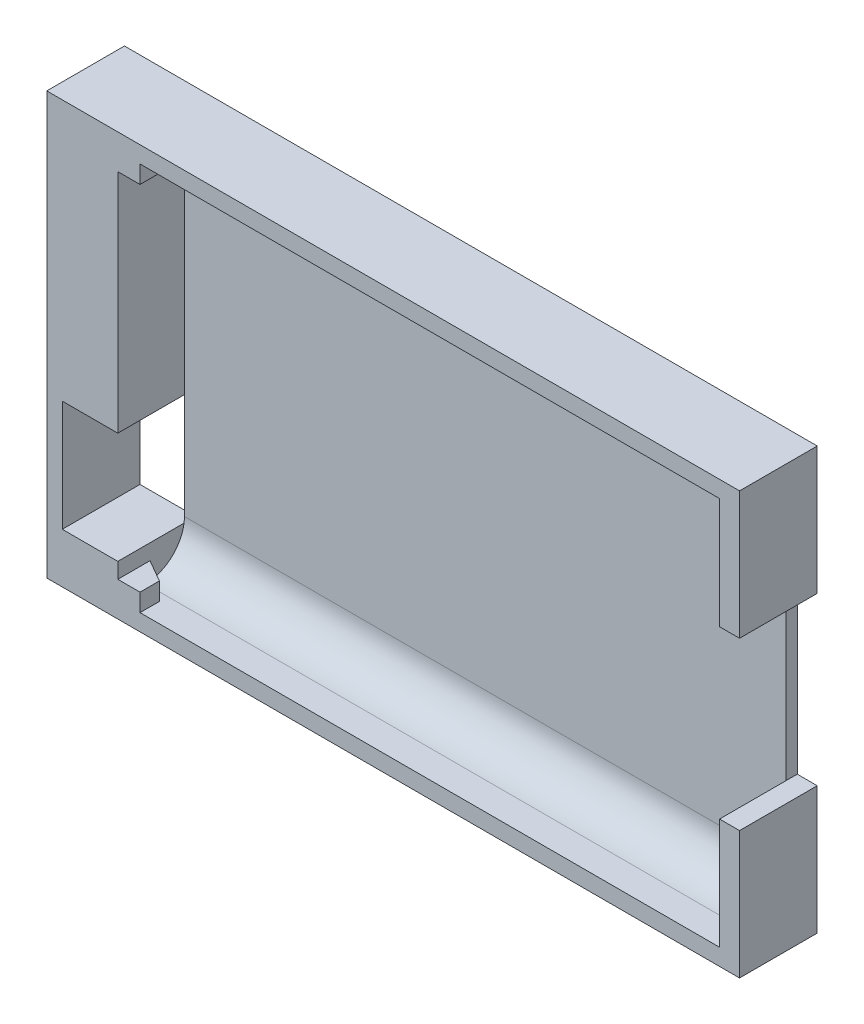
ISO-10303-21;
HEADER;
FILE_DESCRIPTION(('STEP AP214'),'2;1');
FILE_NAME('part.step','',(''),(''),'','','');
FILE_SCHEMA(('AUTOMOTIVE_DESIGN { 1 0 10303 214 1 1 1 1 }'));
ENDSEC;
DATA;
#1=APPLICATION_CONTEXT('core data for automotive mechanical design processes');
#2=APPLICATION_PROTOCOL_DEFINITION('international standard','automotive_design',2000,#1);
#3=PRODUCT_CONTEXT('',#1,'mechanical');
#4=PRODUCT('Part','Part','',(#3));
#5=PRODUCT_RELATED_PRODUCT_CATEGORY('part','',(#4));
#6=PRODUCT_DEFINITION_FORMATION('','',#4);
#7=PRODUCT_DEFINITION_CONTEXT('part definition',#1,'design');
#8=PRODUCT_DEFINITION('design','',#6,#7);
#9=PRODUCT_DEFINITION_SHAPE('','',#8);
#10=(LENGTH_UNIT() NAMED_UNIT(*) SI_UNIT(.MILLI.,.METRE.));
#11=(NAMED_UNIT(*) PLANE_ANGLE_UNIT() SI_UNIT($,.RADIAN.));
#12=(NAMED_UNIT(*) SI_UNIT($,.STERADIAN.) SOLID_ANGLE_UNIT());
#13=UNCERTAINTY_MEASURE_WITH_UNIT(LENGTH_MEASURE(1.E-05),#10,'distance_accuracy_value','');
#14=(GEOMETRIC_REPRESENTATION_CONTEXT(3) GLOBAL_UNCERTAINTY_ASSIGNED_CONTEXT((#13)) GLOBAL_UNIT_ASSIGNED_CONTEXT((#10,
#11,#12)) REPRESENTATION_CONTEXT('',''));
#15=CARTESIAN_POINT('',(0.,0.,0.));
#16=DIRECTION('',(0.,0.,1.));
#17=DIRECTION('',(1.,0.,0.));
#18=AXIS2_PLACEMENT_3D('',#15,#16,#17);
#19=CARTESIAN_POINT('',(-27.1,14.,4.5));
#20=DIRECTION('',(-1.,0.,0.));
#21=DIRECTION('',(0.,0.,1.));
#22=AXIS2_PLACEMENT_3D('',#19,#20,#21);
#23=PLANE('',#22);
#24=DIRECTION('',(0.,-1.,0.));
#25=VECTOR('',#24,1.);
#26=CARTESIAN_POINT('',(-27.1,0.,7.));
#27=LINE('',#26,#25);
#28=CARTESIAN_POINT('',(-27.1,15.9,7.));
#29=VERTEX_POINT('',#28);
#30=CARTESIAN_POINT('',(-27.1,-4.5,7.));
#31=VERTEX_POINT('',#30);
#32=EDGE_CURVE('E374',#29,#31,#27,.T.);
#33=ORIENTED_EDGE('',*,*,#32,.T.);
#34=DIRECTION('',(0.,0.,1.));
#35=VECTOR('',#34,1.);
#36=CARTESIAN_POINT('',(-27.1,-4.5,0.));
#37=LINE('',#36,#35);
#38=CARTESIAN_POINT('',(-27.1,-4.5,1.));
#39=VERTEX_POINT('',#38);
#40=EDGE_CURVE('E240',#39,#31,#37,.T.);
#41=ORIENTED_EDGE('',*,*,#40,.F.);
#42=DIRECTION('',(0.,1.,0.));
#43=VECTOR('',#42,1.);
#44=CARTESIAN_POINT('',(-27.1,-14.,1.));
#45=LINE('',#44,#43);
#46=CARTESIAN_POINT('',(-27.1,14.,1.));
#47=VERTEX_POINT('',#46);
#48=EDGE_CURVE('E298',#39,#47,#45,.T.);
#49=ORIENTED_EDGE('',*,*,#48,.T.);
#50=CARTESIAN_POINT('',(-27.1,14.,4.5));
#51=DIRECTION('',(1.,0.,0.));
#52=DIRECTION('',(0.,0.,1.));
#53=AXIS2_PLACEMENT_3D('',#50,#51,#52);
#54=CIRCLE('',#53,3.5);
#55=CARTESIAN_POINT('',(-27.1,17.4770677301427,4.1));
#56=VERTEX_POINT('',#55);
#57=EDGE_CURVE('E302',#47,#56,#54,.T.);
#58=ORIENTED_EDGE('',*,*,#57,.T.);
#59=DIRECTION('',(0.,1.,0.));
#60=VECTOR('',#59,1.);
#61=CARTESIAN_POINT('',(-27.1,15.9,4.1));
#62=LINE('',#61,#60);
#63=CARTESIAN_POINT('',(-27.1,15.9,4.1));
#64=VERTEX_POINT('',#63);
#65=EDGE_CURVE('E268',#64,#56,#62,.T.);
#66=ORIENTED_EDGE('',*,*,#65,.F.);
#67=DIRECTION('',(0.,0.,-1.));
#68=VECTOR('',#67,1.);
#69=CARTESIAN_POINT('',(-27.1,15.9,4.1));
#70=LINE('',#69,#68);
#71=EDGE_CURVE('E256',#29,#64,#70,.T.);
#72=ORIENTED_EDGE('',*,*,#71,.F.);
#73=EDGE_LOOP('',(#33,#41,#49,#58,#66,#72));
#74=FACE_BOUND('',#73,.T.);
#75=ADVANCED_FACE('F33',(#74),#23,.F.);
#76=CARTESIAN_POINT('',(-27.1,17.5,8.));
#77=DIRECTION('',(0.,1.,0.));
#78=DIRECTION('',(0.,0.,1.));
#79=AXIS2_PLACEMENT_3D('',#76,#77,#78);
#80=PLANE('',#79);
#81=DIRECTION('',(0.,0.,1.));
#82=VECTOR('',#81,1.);
#83=CARTESIAN_POINT('',(-25.1,17.5,7.));
#84=LINE('',#83,#82);
#85=CARTESIAN_POINT('',(-25.1,17.5,5.25470053837925));
#86=VERTEX_POINT('',#85);
#87=CARTESIAN_POINT('',(-25.1,17.5,7.));
#88=VERTEX_POINT('',#87);
#89=EDGE_CURVE('E255',#86,#88,#84,.T.);
#90=ORIENTED_EDGE('',*,*,#89,.F.);
#91=DIRECTION('',(0.86602540378444,0.,0.499999999999997));
#92=VECTOR('',#91,1.);
#93=CARTESIAN_POINT('',(-25.4112504626204,17.5,5.07499999999999));
#94=LINE('',#93,#92);
#95=CARTESIAN_POINT('',(-26.4071796769725,17.5,4.5));
#96=VERTEX_POINT('',#95);
#97=EDGE_CURVE('E386',#86,#96,#94,.F.);
#98=ORIENTED_EDGE('',*,*,#97,.T.);
#99=DIRECTION('',(1.,0.,0.));
#100=VECTOR('',#99,1.);
#101=CARTESIAN_POINT('',(-27.1,17.5,4.5));
#102=LINE('',#101,#100);
#103=CARTESIAN_POINT('',(27.1,17.5,4.5));
#104=VERTEX_POINT('',#103);
#105=EDGE_CURVE('E322',#96,#104,#102,.T.);
#106=ORIENTED_EDGE('',*,*,#105,.T.);
#107=DIRECTION('',(0.,0.,1.));
#108=VECTOR('',#107,1.);
#109=CARTESIAN_POINT('',(27.1,17.5,8.));
#110=LINE('',#109,#108);
#111=CARTESIAN_POINT('',(27.1,17.5,7.));
#112=VERTEX_POINT('',#111);
#113=EDGE_CURVE('E319',#104,#112,#110,.T.);
#114=ORIENTED_EDGE('',*,*,#113,.T.);
#115=DIRECTION('',(-1.,0.,0.));
#116=VECTOR('',#115,1.);
#117=CARTESIAN_POINT('',(0.,17.5,7.));
#118=LINE('',#117,#116);
#119=EDGE_CURVE('E370',#112,#88,#118,.T.);
#120=ORIENTED_EDGE('',*,*,#119,.T.);
#121=EDGE_LOOP('',(#90,#98,#106,#114,#120));
#122=FACE_BOUND('',#121,.T.);
#123=ADVANCED_FACE('F452',(#122),#80,.F.);
#124=CARTESIAN_POINT('',(-27.1,14.,4.5));
#125=DIRECTION('',(1.,0.,0.));
#126=DIRECTION('',(0.,0.,-1.));
#127=AXIS2_PLACEMENT_3D('',#124,#125,#126);
#128=CYLINDRICAL_SURFACE('',#127,3.5);
#129=ORIENTED_EDGE('',*,*,#105,.F.);
#130=CARTESIAN_POINT('',(-26.4071796769725,14.,4.5));
#131=DIRECTION('',(-0.499999999999997,0.,0.86602540378444));
#132=DIRECTION('',(0.86602540378444,0.,0.499999999999997));
#133=AXIS2_PLACEMENT_3D('',#130,#131,#132);
#134=ELLIPSE('',#133,7.00000000000004,3.5);
#135=EDGE_CURVE('E389',#96,#56,#134,.T.);
#136=ORIENTED_EDGE('',*,*,#135,.T.);
#137=ORIENTED_EDGE('',*,*,#57,.F.);
#138=DIRECTION('',(1.,0.,0.));
#139=VECTOR('',#138,1.);
#140=CARTESIAN_POINT('',(-27.1,14.,1.));
#141=LINE('',#140,#139);
#142=CARTESIAN_POINT('',(27.1,14.,1.));
#143=VERTEX_POINT('',#142);
#144=EDGE_CURVE('E325',#47,#143,#141,.T.);
#145=ORIENTED_EDGE('',*,*,#144,.T.);
#146=CARTESIAN_POINT('',(27.1,14.,4.5));
#147=DIRECTION('',(1.,0.,0.));
#148=DIRECTION('',(0.,0.,1.));
#149=AXIS2_PLACEMENT_3D('',#146,#147,#148);
#150=CIRCLE('',#149,3.5);
#151=EDGE_CURVE('E315',#143,#104,#150,.T.);
#152=ORIENTED_EDGE('',*,*,#151,.T.);
#153=EDGE_LOOP('',(#129,#136,#137,#145,#152));
#154=FACE_BOUND('',#153,.T.);
#155=ADVANCED_FACE('F494',(#154),#128,.F.);
#156=CARTESIAN_POINT('',(-27.1,-14.,4.5));
#157=DIRECTION('',(1.,0.,0.));
#158=DIRECTION('',(0.,0.,-1.));
#159=AXIS2_PLACEMENT_3D('',#156,#157,#158);
#160=CIRCLE('',#159,3.5);
#161=CARTESIAN_POINT('',(-27.1,-17.4770677301427,4.1));
#162=VERTEX_POINT('',#161);
#163=CARTESIAN_POINT('',(-27.1,-14.5,1.03589838486224));
#164=VERTEX_POINT('',#163);
#165=EDGE_CURVE('E295',#162,#164,#160,.T.);
#166=ORIENTED_EDGE('',*,*,#165,.T.);
#167=DIRECTION('',(0.,0.,1.));
#168=VECTOR('',#167,1.);
#169=CARTESIAN_POINT('',(-27.1,-14.5,0.));
#170=LINE('',#169,#168);
#171=CARTESIAN_POINT('',(-27.1,-14.5,7.));
#172=VERTEX_POINT('',#171);
#173=EDGE_CURVE('E213',#164,#172,#170,.T.);
#174=ORIENTED_EDGE('',*,*,#173,.T.);
#175=CARTESIAN_POINT('',(-27.1,-15.9,7.));
#176=VERTEX_POINT('',#175);
#177=EDGE_CURVE('E373',#172,#176,#27,.T.);
#178=ORIENTED_EDGE('',*,*,#177,.T.);
#179=DIRECTION('',(0.,0.,-1.));
#180=VECTOR('',#179,1.);
#181=CARTESIAN_POINT('',(-27.1,-15.9,4.1));
#182=LINE('',#181,#180);
#183=CARTESIAN_POINT('',(-27.1,-15.9,4.1));
#184=VERTEX_POINT('',#183);
#185=EDGE_CURVE('E236',#176,#184,#182,.T.);
#186=ORIENTED_EDGE('',*,*,#185,.T.);
#187=DIRECTION('',(0.,-1.,0.));
#188=VECTOR('',#187,1.);
#189=CARTESIAN_POINT('',(-27.1,-15.9,4.1));
#190=LINE('',#189,#188);
#191=EDGE_CURVE('E249',#184,#162,#190,.T.);
#192=ORIENTED_EDGE('',*,*,#191,.T.);
#193=EDGE_LOOP('',(#166,#174,#178,#186,#192));
#194=FACE_BOUND('',#193,.T.);
#195=ADVANCED_FACE('F509',(#194),#23,.F.);
#196=CARTESIAN_POINT('',(28.9,19.,7.));
#197=DIRECTION('',(-1.,0.,0.));
#198=DIRECTION('',(0.,-1.,0.));
#199=AXIS2_PLACEMENT_3D('',#196,#197,#198);
#200=PLANE('',#199);
#201=DIRECTION('',(0.,1.,0.));
#202=VECTOR('',#201,1.);
#203=CARTESIAN_POINT('',(28.9,19.,7.));
#204=LINE('',#203,#202);
#205=CARTESIAN_POINT('',(28.9,7.5,7.));
#206=VERTEX_POINT('',#205);
#207=CARTESIAN_POINT('',(28.9,19.,7.));
#208=VERTEX_POINT('',#207);
#209=EDGE_CURVE('E337',#206,#208,#204,.T.);
#210=ORIENTED_EDGE('',*,*,#209,.F.);
#211=DIRECTION('',(0.,0.,1.));
#212=VECTOR('',#211,1.);
#213=CARTESIAN_POINT('',(28.9,7.5,0.));
#214=LINE('',#213,#212);
#215=CARTESIAN_POINT('',(28.9,7.5,0.));
#216=VERTEX_POINT('',#215);
#217=EDGE_CURVE('E289',#216,#206,#214,.T.);
#218=ORIENTED_EDGE('',*,*,#217,.F.);
#219=DIRECTION('',(0.,1.,0.));
#220=VECTOR('',#219,1.);
#221=CARTESIAN_POINT('',(28.9,19.,0.));
#222=LINE('',#221,#220);
#223=CARTESIAN_POINT('',(28.9,19.,0.));
#224=VERTEX_POINT('',#223);
#225=EDGE_CURVE('E348',#216,#224,#222,.T.);
#226=ORIENTED_EDGE('',*,*,#225,.T.);
#227=DIRECTION('',(0.,0.,-1.));
#228=VECTOR('',#227,1.);
#229=CARTESIAN_POINT('',(28.9,19.,7.));
#230=LINE('',#229,#228);
#231=EDGE_CURVE('E355',#208,#224,#230,.T.);
#232=ORIENTED_EDGE('',*,*,#231,.F.);
#233=EDGE_LOOP('',(#210,#218,#226,#232));
#234=FACE_BOUND('',#233,.T.);
#235=ADVANCED_FACE('F472',(#234),#200,.F.);
#236=CARTESIAN_POINT('',(27.1,14.,4.5));
#237=DIRECTION('',(-1.,0.,0.));
#238=DIRECTION('',(0.,0.,1.));
#239=AXIS2_PLACEMENT_3D('',#236,#237,#238);
#240=PLANE('',#239);
#241=DIRECTION('',(0.,0.,-1.));
#242=VECTOR('',#241,1.);
#243=CARTESIAN_POINT('',(27.1,7.5,4.5));
#244=LINE('',#243,#242);
#245=CARTESIAN_POINT('',(27.1,7.5,7.));
#246=VERTEX_POINT('',#245);
#247=CARTESIAN_POINT('',(27.1,7.5,0.999999999999999));
#248=VERTEX_POINT('',#247);
#249=EDGE_CURVE('E379',#246,#248,#244,.T.);
#250=ORIENTED_EDGE('',*,*,#249,.F.);
#251=DIRECTION('',(0.,-1.,0.));
#252=VECTOR('',#251,1.);
#253=CARTESIAN_POINT('',(27.1,0.,7.));
#254=LINE('',#253,#252);
#255=EDGE_CURVE('E365',#112,#246,#254,.T.);
#256=ORIENTED_EDGE('',*,*,#255,.F.);
#257=ORIENTED_EDGE('',*,*,#113,.F.);
#258=ORIENTED_EDGE('',*,*,#151,.F.);
#259=DIRECTION('',(0.,1.,0.));
#260=VECTOR('',#259,1.);
#261=CARTESIAN_POINT('',(27.1,-14.,1.));
#262=LINE('',#261,#260);
#263=EDGE_CURVE('E311',#248,#143,#262,.T.);
#264=ORIENTED_EDGE('',*,*,#263,.F.);
#265=EDGE_LOOP('',(#250,#256,#257,#258,#264));
#266=FACE_BOUND('',#265,.T.);
#267=ADVANCED_FACE('F457',(#266),#240,.T.);
#268=CARTESIAN_POINT('',(-33.5,19.,7.));
#269=DIRECTION('',(1.,0.,0.));
#270=DIRECTION('',(0.,1.,0.));
#271=AXIS2_PLACEMENT_3D('',#268,#269,#270);
#272=PLANE('',#271);
#273=DIRECTION('',(0.,-1.,0.));
#274=VECTOR('',#273,1.);
#275=CARTESIAN_POINT('',(-33.5,19.,0.));
#276=LINE('',#275,#274);
#277=CARTESIAN_POINT('',(-33.5,19.,0.));
#278=VERTEX_POINT('',#277);
#279=CARTESIAN_POINT('',(-33.5,-19.,0.));
#280=VERTEX_POINT('',#279);
#281=EDGE_CURVE('E324',#278,#280,#276,.T.);
#282=ORIENTED_EDGE('',*,*,#281,.T.);
#283=DIRECTION('',(0.,0.,-1.));
#284=VECTOR('',#283,1.);
#285=CARTESIAN_POINT('',(-33.5,-19.,7.));
#286=LINE('',#285,#284);
#287=CARTESIAN_POINT('',(-33.5,-19.,7.));
#288=VERTEX_POINT('',#287);
#289=EDGE_CURVE('E361',#288,#280,#286,.T.);
#290=ORIENTED_EDGE('',*,*,#289,.F.);
#291=DIRECTION('',(0.,-1.,0.));
#292=VECTOR('',#291,1.);
#293=CARTESIAN_POINT('',(-33.5,19.,7.));
#294=LINE('',#293,#292);
#295=CARTESIAN_POINT('',(-33.5,19.,7.));
#296=VERTEX_POINT('',#295);
#297=EDGE_CURVE('E331',#296,#288,#294,.T.);
#298=ORIENTED_EDGE('',*,*,#297,.F.);
#299=DIRECTION('',(0.,0.,-1.));
#300=VECTOR('',#299,1.);
#301=CARTESIAN_POINT('',(-33.5,19.,7.));
#302=LINE('',#301,#300);
#303=EDGE_CURVE('E343',#296,#278,#302,.T.);
#304=ORIENTED_EDGE('',*,*,#303,.T.);
#305=EDGE_LOOP('',(#282,#290,#298,#304));
#306=FACE_BOUND('',#305,.T.);
#307=ADVANCED_FACE('F482',(#306),#272,.F.);
#308=CARTESIAN_POINT('',(-33.5,-19.,7.));
#309=DIRECTION('',(0.,1.,0.));
#310=DIRECTION('',(0.,0.,1.));
#311=AXIS2_PLACEMENT_3D('',#308,#309,#310);
#312=PLANE('',#311);
#313=DIRECTION('',(1.,0.,0.));
#314=VECTOR('',#313,1.);
#315=CARTESIAN_POINT('',(-33.5,-19.,0.));
#316=LINE('',#315,#314);
#317=CARTESIAN_POINT('',(28.9,-19.,0.));
#318=VERTEX_POINT('',#317);
#319=EDGE_CURVE('E346',#280,#318,#316,.T.);
#320=ORIENTED_EDGE('',*,*,#319,.T.);
#321=DIRECTION('',(0.,0.,-1.));
#322=VECTOR('',#321,1.);
#323=CARTESIAN_POINT('',(28.9,-19.,7.));
#324=LINE('',#323,#322);
#325=CARTESIAN_POINT('',(28.9,-19.,7.));
#326=VERTEX_POINT('',#325);
#327=EDGE_CURVE('E358',#326,#318,#324,.T.);
#328=ORIENTED_EDGE('',*,*,#327,.F.);
#329=DIRECTION('',(1.,0.,0.));
#330=VECTOR('',#329,1.);
#331=CARTESIAN_POINT('',(-33.5,-19.,7.));
#332=LINE('',#331,#330);
#333=EDGE_CURVE('E334',#288,#326,#332,.T.);
#334=ORIENTED_EDGE('',*,*,#333,.F.);
#335=ORIENTED_EDGE('',*,*,#289,.T.);
#336=EDGE_LOOP('',(#320,#328,#334,#335));
#337=FACE_BOUND('',#336,.T.);
#338=ADVANCED_FACE('F484',(#337),#312,.F.);
#339=CARTESIAN_POINT('',(28.9,-7.5,0.));
#340=VERTEX_POINT('',#339);
#341=EDGE_CURVE('E349',#318,#340,#222,.T.);
#342=ORIENTED_EDGE('',*,*,#341,.T.);
#343=DIRECTION('',(0.,0.,1.));
#344=VECTOR('',#343,1.);
#345=CARTESIAN_POINT('',(28.9,-7.5,0.));
#346=LINE('',#345,#344);
#347=CARTESIAN_POINT('',(28.9,-7.5,7.));
#348=VERTEX_POINT('',#347);
#349=EDGE_CURVE('E291',#340,#348,#346,.T.);
#350=ORIENTED_EDGE('',*,*,#349,.T.);
#351=EDGE_CURVE('E338',#326,#348,#204,.T.);
#352=ORIENTED_EDGE('',*,*,#351,.F.);
#353=ORIENTED_EDGE('',*,*,#327,.T.);
#354=EDGE_LOOP('',(#342,#350,#352,#353));
#355=FACE_BOUND('',#354,.T.);
#356=ADVANCED_FACE('F488',(#355),#200,.F.);
#357=CARTESIAN_POINT('',(-33.5,19.,7.));
#358=DIRECTION('',(0.,-1.,0.));
#359=DIRECTION('',(0.,0.,-1.));
#360=AXIS2_PLACEMENT_3D('',#357,#358,#359);
#361=PLANE('',#360);
#362=DIRECTION('',(-1.,0.,0.));
#363=VECTOR('',#362,1.);
#364=CARTESIAN_POINT('',(-33.5,19.,0.));
#365=LINE('',#364,#363);
#366=EDGE_CURVE('E335',#224,#278,#365,.T.);
#367=ORIENTED_EDGE('',*,*,#366,.T.);
#368=ORIENTED_EDGE('',*,*,#303,.F.);
#369=DIRECTION('',(-1.,0.,0.));
#370=VECTOR('',#369,1.);
#371=CARTESIAN_POINT('',(-33.5,19.,7.));
#372=LINE('',#371,#370);
#373=EDGE_CURVE('E341',#208,#296,#372,.T.);
#374=ORIENTED_EDGE('',*,*,#373,.F.);
#375=ORIENTED_EDGE('',*,*,#231,.T.);
#376=EDGE_LOOP('',(#367,#368,#374,#375));
#377=FACE_BOUND('',#376,.T.);
#378=ADVANCED_FACE('F479',(#377),#361,.F.);
#379=CARTESIAN_POINT('',(0.,0.,7.));
#380=DIRECTION('',(0.,0.,1.));
#381=DIRECTION('',(1.,0.,0.));
#382=AXIS2_PLACEMENT_3D('',#379,#380,#381);
#383=PLANE('',#382);
#384=DIRECTION('',(-1.,0.,0.));
#385=VECTOR('',#384,1.);
#386=CARTESIAN_POINT('',(-32.1,-4.49999999999999,7.));
#387=LINE('',#386,#385);
#388=CARTESIAN_POINT('',(-32.1,-4.49999999999999,7.));
#389=VERTEX_POINT('',#388);
#390=EDGE_CURVE('E224',#31,#389,#387,.T.);
#391=ORIENTED_EDGE('',*,*,#390,.F.);
#392=ORIENTED_EDGE('',*,*,#32,.F.);
#393=DIRECTION('',(-1.,0.,0.));
#394=VECTOR('',#393,1.);
#395=CARTESIAN_POINT('',(-27.1,15.9,7.));
#396=LINE('',#395,#394);
#397=CARTESIAN_POINT('',(-25.1,15.9,7.));
#398=VERTEX_POINT('',#397);
#399=EDGE_CURVE('E261',#398,#29,#396,.T.);
#400=ORIENTED_EDGE('',*,*,#399,.F.);
#401=DIRECTION('',(0.,1.,0.));
#402=VECTOR('',#401,1.);
#403=CARTESIAN_POINT('',(-25.1,15.9,7.));
#404=LINE('',#403,#402);
#405=EDGE_CURVE('E264',#398,#88,#404,.T.);
#406=ORIENTED_EDGE('',*,*,#405,.T.);
#407=ORIENTED_EDGE('',*,*,#119,.F.);
#408=ORIENTED_EDGE('',*,*,#255,.T.);
#409=DIRECTION('',(-1.,0.,0.));
#410=VECTOR('',#409,1.);
#411=CARTESIAN_POINT('',(28.9,7.5,7.));
#412=LINE('',#411,#410);
#413=EDGE_CURVE('E276',#206,#246,#412,.T.);
#414=ORIENTED_EDGE('',*,*,#413,.F.);
#415=ORIENTED_EDGE('',*,*,#209,.T.);
#416=ORIENTED_EDGE('',*,*,#373,.T.);
#417=ORIENTED_EDGE('',*,*,#297,.T.);
#418=ORIENTED_EDGE('',*,*,#333,.T.);
#419=ORIENTED_EDGE('',*,*,#351,.T.);
#420=DIRECTION('',(1.,0.,0.));
#421=VECTOR('',#420,1.);
#422=CARTESIAN_POINT('',(28.9,-7.5,7.));
#423=LINE('',#422,#421);
#424=CARTESIAN_POINT('',(27.1,-7.5,7.));
#425=VERTEX_POINT('',#424);
#426=EDGE_CURVE('E271',#425,#348,#423,.T.);
#427=ORIENTED_EDGE('',*,*,#426,.F.);
#428=CARTESIAN_POINT('',(27.1,-17.5,7.));
#429=VERTEX_POINT('',#428);
#430=EDGE_CURVE('E364',#425,#429,#254,.T.);
#431=ORIENTED_EDGE('',*,*,#430,.T.);
#432=DIRECTION('',(1.,0.,0.));
#433=VECTOR('',#432,1.);
#434=CARTESIAN_POINT('',(0.,-17.5,7.));
#435=LINE('',#434,#433);
#436=CARTESIAN_POINT('',(-25.1,-17.5,7.));
#437=VERTEX_POINT('',#436);
#438=EDGE_CURVE('E368',#437,#429,#435,.T.);
#439=ORIENTED_EDGE('',*,*,#438,.F.);
#440=DIRECTION('',(0.,-1.,0.));
#441=VECTOR('',#440,1.);
#442=CARTESIAN_POINT('',(-25.1,-15.9,7.));
#443=LINE('',#442,#441);
#444=CARTESIAN_POINT('',(-25.1,-15.9,7.));
#445=VERTEX_POINT('',#444);
#446=EDGE_CURVE('E252',#445,#437,#443,.T.);
#447=ORIENTED_EDGE('',*,*,#446,.F.);
#448=DIRECTION('',(-1.,0.,0.));
#449=VECTOR('',#448,1.);
#450=CARTESIAN_POINT('',(-27.1,-15.9,7.));
#451=LINE('',#450,#449);
#452=EDGE_CURVE('E244',#445,#176,#451,.T.);
#453=ORIENTED_EDGE('',*,*,#452,.T.);
#454=ORIENTED_EDGE('',*,*,#177,.F.);
#455=DIRECTION('',(1.,0.,0.));
#456=VECTOR('',#455,1.);
#457=CARTESIAN_POINT('',(-32.1,-14.5,7.));
#458=LINE('',#457,#456);
#459=CARTESIAN_POINT('',(-32.1,-14.5,7.));
#460=VERTEX_POINT('',#459);
#461=EDGE_CURVE('E227',#460,#172,#458,.T.);
#462=ORIENTED_EDGE('',*,*,#461,.F.);
#463=DIRECTION('',(0.,-1.,0.));
#464=VECTOR('',#463,1.);
#465=CARTESIAN_POINT('',(-32.1,-4.49999999999999,7.));
#466=LINE('',#465,#464);
#467=EDGE_CURVE('E210',#389,#460,#466,.T.);
#468=ORIENTED_EDGE('',*,*,#467,.F.);
#469=EDGE_LOOP('',(#391,#392,#400,#406,#407,#408,#414,#415,#416,#417,#418,#419,#427,#431,#439,
#447,#453,#454,#462,#468));
#470=FACE_BOUND('',#469,.T.);
#471=ADVANCED_FACE('F418',(#470),#383,.T.);
#472=CARTESIAN_POINT('',(0.,0.,0.));
#473=DIRECTION('',(0.,0.,1.));
#474=DIRECTION('',(1.,0.,0.));
#475=AXIS2_PLACEMENT_3D('',#472,#473,#474);
#476=PLANE('',#475);
#477=DIRECTION('',(-1.,0.,0.));
#478=VECTOR('',#477,1.);
#479=CARTESIAN_POINT('',(-32.1,-4.49999999999999,0.));
#480=LINE('',#479,#478);
#481=CARTESIAN_POINT('',(-27.1,-4.5,0.));
#482=VERTEX_POINT('',#481);
#483=CARTESIAN_POINT('',(-32.1,-4.49999999999999,0.));
#484=VERTEX_POINT('',#483);
#485=EDGE_CURVE('E214',#482,#484,#480,.T.);
#486=ORIENTED_EDGE('',*,*,#485,.T.);
#487=DIRECTION('',(0.,-1.,0.));
#488=VECTOR('',#487,1.);
#489=CARTESIAN_POINT('',(-32.1,-4.49999999999999,0.));
#490=LINE('',#489,#488);
#491=CARTESIAN_POINT('',(-32.1,-14.5,0.));
#492=VERTEX_POINT('',#491);
#493=EDGE_CURVE('E207',#484,#492,#490,.T.);
#494=ORIENTED_EDGE('',*,*,#493,.T.);
#495=DIRECTION('',(1.,0.,0.));
#496=VECTOR('',#495,1.);
#497=CARTESIAN_POINT('',(-32.1,-14.5,0.));
#498=LINE('',#497,#496);
#499=CARTESIAN_POINT('',(-27.1,-14.5,0.));
#500=VERTEX_POINT('',#499);
#501=EDGE_CURVE('E217',#492,#500,#498,.T.);
#502=ORIENTED_EDGE('',*,*,#501,.T.);
#503=DIRECTION('',(0.,1.,0.));
#504=VECTOR('',#503,1.);
#505=CARTESIAN_POINT('',(-27.1,-4.5,0.));
#506=LINE('',#505,#504);
#507=EDGE_CURVE('E48',#500,#482,#506,.T.);
#508=ORIENTED_EDGE('',*,*,#507,.T.);
#509=EDGE_LOOP('',(#486,#494,#502,#508));
#510=FACE_BOUND('',#509,.T.);
#511=ORIENTED_EDGE('',*,*,#225,.F.);
#512=DIRECTION('',(-1.,0.,0.));
#513=VECTOR('',#512,1.);
#514=CARTESIAN_POINT('',(28.9,7.5,0.));
#515=LINE('',#514,#513);
#516=CARTESIAN_POINT('',(27.1,7.5,0.));
#517=VERTEX_POINT('',#516);
#518=EDGE_CURVE('E279',#216,#517,#515,.T.);
#519=ORIENTED_EDGE('',*,*,#518,.T.);
#520=DIRECTION('',(0.,-1.,0.));
#521=VECTOR('',#520,1.);
#522=CARTESIAN_POINT('',(27.1,7.5,0.));
#523=LINE('',#522,#521);
#524=CARTESIAN_POINT('',(27.1,-7.5,0.));
#525=VERTEX_POINT('',#524);
#526=EDGE_CURVE('E272',#517,#525,#523,.T.);
#527=ORIENTED_EDGE('',*,*,#526,.T.);
#528=DIRECTION('',(1.,0.,0.));
#529=VECTOR('',#528,1.);
#530=CARTESIAN_POINT('',(28.9,-7.5,0.));
#531=LINE('',#530,#529);
#532=EDGE_CURVE('E275',#525,#340,#531,.T.);
#533=ORIENTED_EDGE('',*,*,#532,.T.);
#534=ORIENTED_EDGE('',*,*,#341,.F.);
#535=ORIENTED_EDGE('',*,*,#319,.F.);
#536=ORIENTED_EDGE('',*,*,#281,.F.);
#537=ORIENTED_EDGE('',*,*,#366,.F.);
#538=EDGE_LOOP('',(#511,#519,#527,#533,#534,#535,#536,#537));
#539=FACE_BOUND('',#538,.T.);
#540=ADVANCED_FACE('F221',(#510,#539),#476,.F.);
#541=CARTESIAN_POINT('',(-27.1,-14.,1.));
#542=DIRECTION('',(0.,0.,-1.));
#543=DIRECTION('',(0.,1.,0.));
#544=AXIS2_PLACEMENT_3D('',#541,#542,#543);
#545=PLANE('',#544);
#546=CARTESIAN_POINT('',(27.1,-14.,1.));
#547=VERTEX_POINT('',#546);
#548=CARTESIAN_POINT('',(27.1,-7.5,1.));
#549=VERTEX_POINT('',#548);
#550=EDGE_CURVE('E312',#547,#549,#262,.T.);
#551=ORIENTED_EDGE('',*,*,#550,.T.);
#552=EDGE_CURVE('E316',#549,#248,#262,.T.);
#553=ORIENTED_EDGE('',*,*,#552,.T.);
#554=ORIENTED_EDGE('',*,*,#263,.T.);
#555=ORIENTED_EDGE('',*,*,#144,.F.);
#556=ORIENTED_EDGE('',*,*,#48,.F.);
#557=CARTESIAN_POINT('',(-27.1,-14.,0.999999999999999));
#558=VERTEX_POINT('',#557);
#559=EDGE_CURVE('E300',#558,#39,#45,.T.);
#560=ORIENTED_EDGE('',*,*,#559,.F.);
#561=DIRECTION('',(1.,0.,0.));
#562=VECTOR('',#561,1.);
#563=CARTESIAN_POINT('',(-27.1,-14.,1.));
#564=LINE('',#563,#562);
#565=EDGE_CURVE('E328',#558,#547,#564,.T.);
#566=ORIENTED_EDGE('',*,*,#565,.T.);
#567=EDGE_LOOP('',(#551,#553,#554,#555,#556,#560,#566));
#568=FACE_BOUND('',#567,.T.);
#569=ADVANCED_FACE('F431',(#568),#545,.F.);
#570=CARTESIAN_POINT('',(-27.1,-14.,4.5));
#571=DIRECTION('',(1.,0.,0.));
#572=DIRECTION('',(0.,0.,-1.));
#573=AXIS2_PLACEMENT_3D('',#570,#571,#572);
#574=CYLINDRICAL_SURFACE('',#573,3.5);
#575=ORIENTED_EDGE('',*,*,#165,.F.);
#576=CARTESIAN_POINT('',(-26.4071796769725,-14.,4.5));
#577=DIRECTION('',(-0.499999999999997,0.,0.86602540378444));
#578=DIRECTION('',(0.86602540378444,0.,0.499999999999997));
#579=AXIS2_PLACEMENT_3D('',#576,#577,#578);
#580=ELLIPSE('',#579,7.00000000000003,3.5);
#581=CARTESIAN_POINT('',(-26.4071796769725,-17.5,4.5));
#582=VERTEX_POINT('',#581);
#583=EDGE_CURVE('E41',#162,#582,#580,.T.);
#584=ORIENTED_EDGE('',*,*,#583,.T.);
#585=DIRECTION('',(1.,0.,0.));
#586=VECTOR('',#585,1.);
#587=CARTESIAN_POINT('',(-27.1,-17.5,4.5));
#588=LINE('',#587,#586);
#589=CARTESIAN_POINT('',(27.1,-17.5,4.5));
#590=VERTEX_POINT('',#589);
#591=EDGE_CURVE('E305',#582,#590,#588,.T.);
#592=ORIENTED_EDGE('',*,*,#591,.T.);
#593=CARTESIAN_POINT('',(27.1,-14.,4.5));
#594=DIRECTION('',(1.,0.,0.));
#595=DIRECTION('',(0.,0.,-1.));
#596=AXIS2_PLACEMENT_3D('',#593,#594,#595);
#597=CIRCLE('',#596,3.5);
#598=EDGE_CURVE('E308',#590,#547,#597,.T.);
#599=ORIENTED_EDGE('',*,*,#598,.T.);
#600=ORIENTED_EDGE('',*,*,#565,.F.);
#601=EDGE_CURVE('E299',#164,#558,#160,.T.);
#602=ORIENTED_EDGE('',*,*,#601,.F.);
#603=EDGE_LOOP('',(#575,#584,#592,#599,#600,#602));
#604=FACE_BOUND('',#603,.T.);
#605=ADVANCED_FACE('F400',(#604),#574,.F.);
#606=CARTESIAN_POINT('',(-27.1,-17.5,8.));
#607=DIRECTION('',(0.,-1.,0.));
#608=DIRECTION('',(0.,0.,-1.));
#609=AXIS2_PLACEMENT_3D('',#606,#607,#608);
#610=PLANE('',#609);
#611=ORIENTED_EDGE('',*,*,#591,.F.);
#612=DIRECTION('',(-0.86602540378444,0.,-0.499999999999997));
#613=VECTOR('',#612,1.);
#614=CARTESIAN_POINT('',(-25.4112504626204,-17.5,5.07499999999999));
#615=LINE('',#614,#613);
#616=CARTESIAN_POINT('',(-25.1,-17.5,5.25470053837925));
#617=VERTEX_POINT('',#616);
#618=EDGE_CURVE('E11',#582,#617,#615,.F.);
#619=ORIENTED_EDGE('',*,*,#618,.T.);
#620=DIRECTION('',(0.,0.,1.));
#621=VECTOR('',#620,1.);
#622=CARTESIAN_POINT('',(-25.1,-17.5,8.));
#623=LINE('',#622,#621);
#624=EDGE_CURVE('E391',#617,#437,#623,.T.);
#625=ORIENTED_EDGE('',*,*,#624,.T.);
#626=ORIENTED_EDGE('',*,*,#438,.T.);
#627=DIRECTION('',(0.,0.,-1.));
#628=VECTOR('',#627,1.);
#629=CARTESIAN_POINT('',(27.1,-17.5,8.));
#630=LINE('',#629,#628);
#631=EDGE_CURVE('E288',#429,#590,#630,.T.);
#632=ORIENTED_EDGE('',*,*,#631,.T.);
#633=EDGE_LOOP('',(#611,#619,#625,#626,#632));
#634=FACE_BOUND('',#633,.T.);
#635=ADVANCED_FACE('F408',(#634),#610,.F.);
#636=DIRECTION('',(0.,0.,1.));
#637=VECTOR('',#636,1.);
#638=CARTESIAN_POINT('',(27.1,-7.5,4.5));
#639=LINE('',#638,#637);
#640=EDGE_CURVE('E377',#549,#425,#639,.T.);
#641=ORIENTED_EDGE('',*,*,#640,.F.);
#642=ORIENTED_EDGE('',*,*,#550,.F.);
#643=ORIENTED_EDGE('',*,*,#598,.F.);
#644=ORIENTED_EDGE('',*,*,#631,.F.);
#645=ORIENTED_EDGE('',*,*,#430,.F.);
#646=EDGE_LOOP('',(#641,#642,#643,#644,#645));
#647=FACE_BOUND('',#646,.T.);
#648=ADVANCED_FACE('F426',(#647),#240,.T.);
#649=CARTESIAN_POINT('',(27.1,7.5,0.));
#650=DIRECTION('',(-1.,0.,0.));
#651=DIRECTION('',(0.,0.,1.));
#652=AXIS2_PLACEMENT_3D('',#649,#650,#651);
#653=PLANE('',#652);
#654=DIRECTION('',(0.,0.,1.));
#655=VECTOR('',#654,1.);
#656=CARTESIAN_POINT('',(27.1,-7.5,0.));
#657=LINE('',#656,#655);
#658=EDGE_CURVE('E282',#525,#549,#657,.T.);
#659=ORIENTED_EDGE('',*,*,#658,.F.);
#660=ORIENTED_EDGE('',*,*,#526,.F.);
#661=DIRECTION('',(0.,0.,1.));
#662=VECTOR('',#661,1.);
#663=CARTESIAN_POINT('',(27.1,7.5,0.));
#664=LINE('',#663,#662);
#665=EDGE_CURVE('E285',#517,#248,#664,.T.);
#666=ORIENTED_EDGE('',*,*,#665,.T.);
#667=ORIENTED_EDGE('',*,*,#552,.F.);
#668=EDGE_LOOP('',(#659,#660,#666,#667));
#669=FACE_BOUND('',#668,.T.);
#670=ADVANCED_FACE('F465',(#669),#653,.F.);
#671=CARTESIAN_POINT('',(28.9,7.5,0.));
#672=DIRECTION('',(0.,1.,0.));
#673=DIRECTION('',(0.,0.,1.));
#674=AXIS2_PLACEMENT_3D('',#671,#672,#673);
#675=PLANE('',#674);
#676=ORIENTED_EDGE('',*,*,#413,.T.);
#677=ORIENTED_EDGE('',*,*,#249,.T.);
#678=ORIENTED_EDGE('',*,*,#665,.F.);
#679=ORIENTED_EDGE('',*,*,#518,.F.);
#680=ORIENTED_EDGE('',*,*,#217,.T.);
#681=EDGE_LOOP('',(#676,#677,#678,#679,#680));
#682=FACE_BOUND('',#681,.T.);
#683=ADVANCED_FACE('F461',(#682),#675,.F.);
#684=CARTESIAN_POINT('',(28.9,-7.5,0.));
#685=DIRECTION('',(0.,-1.,0.));
#686=DIRECTION('',(1.,0.,0.));
#687=AXIS2_PLACEMENT_3D('',#684,#685,#686);
#688=PLANE('',#687);
#689=ORIENTED_EDGE('',*,*,#426,.T.);
#690=ORIENTED_EDGE('',*,*,#349,.F.);
#691=ORIENTED_EDGE('',*,*,#532,.F.);
#692=ORIENTED_EDGE('',*,*,#658,.T.);
#693=ORIENTED_EDGE('',*,*,#640,.T.);
#694=EDGE_LOOP('',(#689,#690,#691,#692,#693));
#695=FACE_BOUND('',#694,.T.);
#696=ADVANCED_FACE('F491',(#695),#688,.F.);
#697=CARTESIAN_POINT('',(-25.1,15.9,7.));
#698=DIRECTION('',(-1.,0.,0.));
#699=DIRECTION('',(0.,0.,1.));
#700=AXIS2_PLACEMENT_3D('',#697,#698,#699);
#701=PLANE('',#700);
#702=DIRECTION('',(0.,0.,1.));
#703=VECTOR('',#702,1.);
#704=CARTESIAN_POINT('',(-25.1,15.9,7.));
#705=LINE('',#704,#703);
#706=CARTESIAN_POINT('',(-25.1,15.9,5.25470053837925));
#707=VERTEX_POINT('',#706);
#708=EDGE_CURVE('E259',#707,#398,#705,.T.);
#709=ORIENTED_EDGE('',*,*,#708,.F.);
#710=DIRECTION('',(0.,1.,0.));
#711=VECTOR('',#710,1.);
#712=CARTESIAN_POINT('',(-25.1,15.9,5.25470053837925));
#713=LINE('',#712,#711);
#714=EDGE_CURVE('E381',#707,#86,#713,.T.);
#715=ORIENTED_EDGE('',*,*,#714,.T.);
#716=ORIENTED_EDGE('',*,*,#89,.T.);
#717=ORIENTED_EDGE('',*,*,#405,.F.);
#718=EDGE_LOOP('',(#709,#715,#716,#717));
#719=FACE_BOUND('',#718,.T.);
#720=ADVANCED_FACE('F447',(#719),#701,.F.);
#721=CARTESIAN_POINT('',(0.,15.9,0.));
#722=DIRECTION('',(0.,1.,0.));
#723=DIRECTION('',(0.,0.,1.));
#724=AXIS2_PLACEMENT_3D('',#721,#722,#723);
#725=PLANE('',#724);
#726=ORIENTED_EDGE('',*,*,#71,.T.);
#727=DIRECTION('',(-0.86602540378444,0.,-0.499999999999997));
#728=VECTOR('',#727,1.);
#729=CARTESIAN_POINT('',(-25.1,15.9,5.25470053837925));
#730=LINE('',#729,#728);
#731=EDGE_CURVE('E384',#64,#707,#730,.F.);
#732=ORIENTED_EDGE('',*,*,#731,.T.);
#733=ORIENTED_EDGE('',*,*,#708,.T.);
#734=ORIENTED_EDGE('',*,*,#399,.T.);
#735=EDGE_LOOP('',(#726,#732,#733,#734));
#736=FACE_BOUND('',#735,.T.);
#737=ADVANCED_FACE('F441',(#736),#725,.F.);
#738=CARTESIAN_POINT('',(-25.1,15.9,5.25470053837925));
#739=DIRECTION('',(-0.499999999999997,0.,0.86602540378444));
#740=DIRECTION('',(0.,1.,0.));
#741=AXIS2_PLACEMENT_3D('',#738,#739,#740);
#742=PLANE('',#741);
#743=ORIENTED_EDGE('',*,*,#731,.F.);
#744=ORIENTED_EDGE('',*,*,#65,.T.);
#745=ORIENTED_EDGE('',*,*,#135,.F.);
#746=ORIENTED_EDGE('',*,*,#97,.F.);
#747=ORIENTED_EDGE('',*,*,#714,.F.);
#748=EDGE_LOOP('',(#743,#744,#745,#746,#747));
#749=FACE_BOUND('',#748,.T.);
#750=ADVANCED_FACE('F497',(#749),#742,.F.);
#751=CARTESIAN_POINT('',(-25.1,-15.9,7.));
#752=DIRECTION('',(1.,0.,0.));
#753=DIRECTION('',(0.,0.,-1.));
#754=AXIS2_PLACEMENT_3D('',#751,#752,#753);
#755=PLANE('',#754);
#756=ORIENTED_EDGE('',*,*,#624,.F.);
#757=DIRECTION('',(0.,1.,0.));
#758=VECTOR('',#757,1.);
#759=CARTESIAN_POINT('',(-25.1,-15.9,5.25470053837925));
#760=LINE('',#759,#758);
#761=CARTESIAN_POINT('',(-25.1,-15.9,5.25470053837925));
#762=VERTEX_POINT('',#761);
#763=EDGE_CURVE('E393',#617,#762,#760,.T.);
#764=ORIENTED_EDGE('',*,*,#763,.T.);
#765=DIRECTION('',(0.,0.,1.));
#766=VECTOR('',#765,1.);
#767=CARTESIAN_POINT('',(-25.1,-15.9,7.));
#768=LINE('',#767,#766);
#769=EDGE_CURVE('E247',#762,#445,#768,.T.);
#770=ORIENTED_EDGE('',*,*,#769,.T.);
#771=ORIENTED_EDGE('',*,*,#446,.T.);
#772=EDGE_LOOP('',(#756,#764,#770,#771));
#773=FACE_BOUND('',#772,.T.);
#774=ADVANCED_FACE('F410',(#773),#755,.T.);
#775=CARTESIAN_POINT('',(0.,-15.9,0.));
#776=DIRECTION('',(0.,-1.,0.));
#777=DIRECTION('',(0.,0.,1.));
#778=AXIS2_PLACEMENT_3D('',#775,#776,#777);
#779=PLANE('',#778);
#780=ORIENTED_EDGE('',*,*,#769,.F.);
#781=DIRECTION('',(0.86602540378444,0.,0.499999999999997));
#782=VECTOR('',#781,1.);
#783=CARTESIAN_POINT('',(-27.1,-15.9,4.1));
#784=LINE('',#783,#782);
#785=EDGE_CURVE('E395',#762,#184,#784,.F.);
#786=ORIENTED_EDGE('',*,*,#785,.T.);
#787=ORIENTED_EDGE('',*,*,#185,.F.);
#788=ORIENTED_EDGE('',*,*,#452,.F.);
#789=EDGE_LOOP('',(#780,#786,#787,#788));
#790=FACE_BOUND('',#789,.T.);
#791=ADVANCED_FACE('F503',(#790),#779,.F.);
#792=CARTESIAN_POINT('',(-27.1,-15.9,4.1));
#793=DIRECTION('',(-0.499999999999997,0.,0.86602540378444));
#794=DIRECTION('',(0.,-1.,0.));
#795=AXIS2_PLACEMENT_3D('',#792,#793,#794);
#796=PLANE('',#795);
#797=ORIENTED_EDGE('',*,*,#785,.F.);
#798=ORIENTED_EDGE('',*,*,#763,.F.);
#799=ORIENTED_EDGE('',*,*,#618,.F.);
#800=ORIENTED_EDGE('',*,*,#583,.F.);
#801=ORIENTED_EDGE('',*,*,#191,.F.);
#802=EDGE_LOOP('',(#797,#798,#799,#800,#801));
#803=FACE_BOUND('',#802,.T.);
#804=ADVANCED_FACE('F35',(#803),#796,.F.);
#805=CARTESIAN_POINT('',(-27.1,-4.5,0.));
#806=DIRECTION('',(1.,0.,0.));
#807=DIRECTION('',(0.,1.,0.));
#808=AXIS2_PLACEMENT_3D('',#805,#806,#807);
#809=PLANE('',#808);
#810=EDGE_CURVE('E237',#482,#39,#37,.T.);
#811=ORIENTED_EDGE('',*,*,#810,.F.);
#812=ORIENTED_EDGE('',*,*,#507,.F.);
#813=EDGE_CURVE('E52',#500,#164,#170,.T.);
#814=ORIENTED_EDGE('',*,*,#813,.T.);
#815=ORIENTED_EDGE('',*,*,#601,.T.);
#816=ORIENTED_EDGE('',*,*,#559,.T.);
#817=EDGE_LOOP('',(#811,#812,#814,#815,#816));
#818=FACE_BOUND('',#817,.T.);
#819=ADVANCED_FACE('F433',(#818),#809,.F.);
#820=CARTESIAN_POINT('',(-32.1,-4.49999999999999,0.));
#821=DIRECTION('',(-1.,0.,0.));
#822=DIRECTION('',(0.,0.,1.));
#823=AXIS2_PLACEMENT_3D('',#820,#821,#822);
#824=PLANE('',#823);
#825=ORIENTED_EDGE('',*,*,#467,.T.);
#826=DIRECTION('',(0.,0.,1.));
#827=VECTOR('',#826,1.);
#828=CARTESIAN_POINT('',(-32.1,-14.5,0.));
#829=LINE('',#828,#827);
#830=EDGE_CURVE('E203',#492,#460,#829,.T.);
#831=ORIENTED_EDGE('',*,*,#830,.F.);
#832=ORIENTED_EDGE('',*,*,#493,.F.);
#833=DIRECTION('',(0.,0.,1.));
#834=VECTOR('',#833,1.);
#835=CARTESIAN_POINT('',(-32.1,-4.49999999999999,0.));
#836=LINE('',#835,#834);
#837=EDGE_CURVE('E234',#484,#389,#836,.T.);
#838=ORIENTED_EDGE('',*,*,#837,.T.);
#839=EDGE_LOOP('',(#825,#831,#832,#838));
#840=FACE_BOUND('',#839,.T.);
#841=ADVANCED_FACE('F205',(#840),#824,.F.);
#842=CARTESIAN_POINT('',(-32.1,-4.49999999999999,0.));
#843=DIRECTION('',(0.,1.,0.));
#844=DIRECTION('',(-1.,0.,0.));
#845=AXIS2_PLACEMENT_3D('',#842,#843,#844);
#846=PLANE('',#845);
#847=ORIENTED_EDGE('',*,*,#390,.T.);
#848=ORIENTED_EDGE('',*,*,#837,.F.);
#849=ORIENTED_EDGE('',*,*,#485,.F.);
#850=ORIENTED_EDGE('',*,*,#810,.T.);
#851=ORIENTED_EDGE('',*,*,#40,.T.);
#852=EDGE_LOOP('',(#847,#848,#849,#850,#851));
#853=FACE_BOUND('',#852,.T.);
#854=ADVANCED_FACE('F436',(#853),#846,.F.);
#855=CARTESIAN_POINT('',(-32.1,-14.5,0.));
#856=DIRECTION('',(0.,-1.,0.));
#857=DIRECTION('',(1.,0.,0.));
#858=AXIS2_PLACEMENT_3D('',#855,#856,#857);
#859=PLANE('',#858);
#860=ORIENTED_EDGE('',*,*,#461,.T.);
#861=ORIENTED_EDGE('',*,*,#173,.F.);
#862=ORIENTED_EDGE('',*,*,#813,.F.);
#863=ORIENTED_EDGE('',*,*,#501,.F.);
#864=ORIENTED_EDGE('',*,*,#830,.T.);
#865=EDGE_LOOP('',(#860,#861,#862,#863,#864));
#866=FACE_BOUND('',#865,.T.);
#867=ADVANCED_FACE('F218',(#866),#859,.F.);
#868=CLOSED_SHELL('',(#75,#123,#155,#195,#235,#267,#307,#338,#356,#378,#471,#540,#569,#605,#635,
#648,#670,#683,#696,#720,#737,#750,#774,#791,#804,#819,#841,#854,#867));
#869=MANIFOLD_SOLID_BREP('B2',#868);
#870=ADVANCED_BREP_SHAPE_REPRESENTATION('',(#18,#869),#14);
#871=SHAPE_DEFINITION_REPRESENTATION(#9,#870);
ENDSEC;
END-ISO-10303-21;
